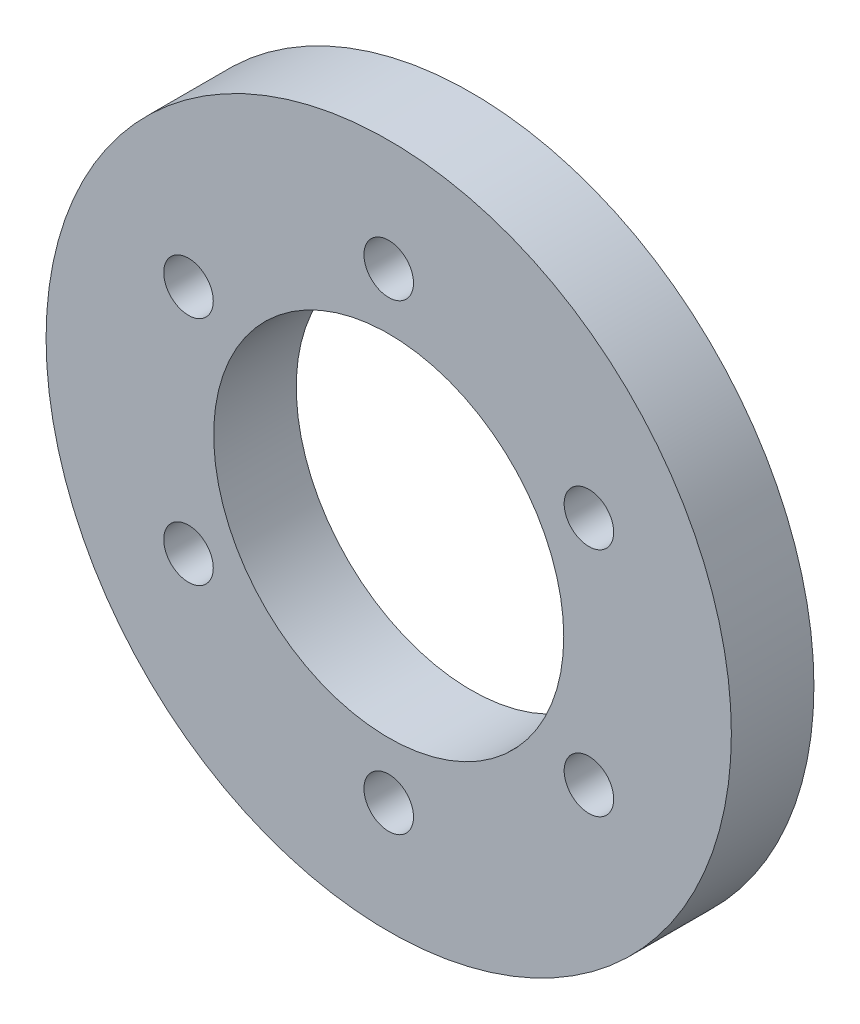
ISO-10303-21;
HEADER;
FILE_DESCRIPTION(('STEP AP214'),'2;1');
FILE_NAME('part.step','',(''),(''),'','','');
FILE_SCHEMA(('AUTOMOTIVE_DESIGN { 1 0 10303 214 1 1 1 1 }'));
ENDSEC;
DATA;
#1=APPLICATION_CONTEXT('core data for automotive mechanical design processes');
#2=APPLICATION_PROTOCOL_DEFINITION('international standard','automotive_design',2000,#1);
#3=PRODUCT_CONTEXT('',#1,'mechanical');
#4=PRODUCT('Part','Part','',(#3));
#5=PRODUCT_RELATED_PRODUCT_CATEGORY('part','',(#4));
#6=PRODUCT_DEFINITION_FORMATION('','',#4);
#7=PRODUCT_DEFINITION_CONTEXT('part definition',#1,'design');
#8=PRODUCT_DEFINITION('design','',#6,#7);
#9=PRODUCT_DEFINITION_SHAPE('','',#8);
#10=(LENGTH_UNIT() NAMED_UNIT(*) SI_UNIT(.MILLI.,.METRE.));
#11=(NAMED_UNIT(*) PLANE_ANGLE_UNIT() SI_UNIT($,.RADIAN.));
#12=(NAMED_UNIT(*) SI_UNIT($,.STERADIAN.) SOLID_ANGLE_UNIT());
#13=UNCERTAINTY_MEASURE_WITH_UNIT(LENGTH_MEASURE(1.E-05),#10,'distance_accuracy_value','');
#14=(GEOMETRIC_REPRESENTATION_CONTEXT(3) GLOBAL_UNCERTAINTY_ASSIGNED_CONTEXT((#13)) GLOBAL_UNIT_ASSIGNED_CONTEXT((#10,
#11,#12)) REPRESENTATION_CONTEXT('',''));
#15=CARTESIAN_POINT('',(0.,0.,0.));
#16=DIRECTION('',(0.,0.,1.));
#17=DIRECTION('',(1.,0.,0.));
#18=AXIS2_PLACEMENT_3D('',#15,#16,#17);
#19=CARTESIAN_POINT('',(5.34781108285642E-11,-5.42088596233725E-11,5.));
#20=DIRECTION('',(0.,0.,1.));
#21=DIRECTION('',(1.,0.,0.));
#22=AXIS2_PLACEMENT_3D('',#19,#20,#21);
#23=PLANE('',#22);
#24=CARTESIAN_POINT('',(5.03034523757773E-11,13.9999999999458,5.));
#25=DIRECTION('',(0.,0.,1.));
#26=DIRECTION('',(1.,0.,0.));
#27=AXIS2_PLACEMENT_3D('',#24,#25,#26);
#28=CIRCLE('',#27,1.5);
#29=CARTESIAN_POINT('',(1.5000000000503,13.9999999999458,5.));
#30=VERTEX_POINT('',#29);
#31=EDGE_CURVE('E79',#30,#30,#28,.T.);
#32=ORIENTED_EDGE('',*,*,#31,.F.);
#33=EDGE_LOOP('',(#32));
#34=FACE_BOUND('',#33,.T.);
#35=CARTESIAN_POINT('',(12.1243556530372,-7.00000000005146,5.));
#36=DIRECTION('',(0.,0.,1.));
#37=DIRECTION('',(1.,0.,0.));
#38=AXIS2_PLACEMENT_3D('',#35,#36,#37);
#39=CIRCLE('',#38,1.5);
#40=CARTESIAN_POINT('',(13.6243556530372,-7.00000000005146,5.));
#41=VERTEX_POINT('',#40);
#42=EDGE_CURVE('E67',#41,#41,#39,.T.);
#43=ORIENTED_EDGE('',*,*,#42,.F.);
#44=EDGE_LOOP('',(#43));
#45=FACE_BOUND('',#44,.T.);
#46=CARTESIAN_POINT('',(-12.124355652927,-7.00000000005696,5.));
#47=DIRECTION('',(0.,0.,1.));
#48=DIRECTION('',(1.,0.,0.));
#49=AXIS2_PLACEMENT_3D('',#46,#47,#48);
#50=CIRCLE('',#49,1.5);
#51=CARTESIAN_POINT('',(-10.624355652927,-7.00000000005696,5.));
#52=VERTEX_POINT('',#51);
#53=EDGE_CURVE('E55',#52,#52,#50,.T.);
#54=ORIENTED_EDGE('',*,*,#53,.F.);
#55=EDGE_LOOP('',(#54));
#56=FACE_BOUND('',#55,.T.);
#57=CARTESIAN_POINT('',(5.34781108285642E-11,-5.42088596233725E-11,5.));
#58=DIRECTION('',(0.,0.,1.));
#59=DIRECTION('',(1.,0.,0.));
#60=AXIS2_PLACEMENT_3D('',#57,#58,#59);
#61=CIRCLE('',#60,20.7499999999);
#62=CARTESIAN_POINT('',(20.7499999999535,-5.42088596233725E-11,5.));
#63=VERTEX_POINT('',#62);
#64=EDGE_CURVE('E10',#63,#63,#61,.T.);
#65=ORIENTED_EDGE('',*,*,#64,.T.);
#66=EDGE_LOOP('',(#65));
#67=FACE_BOUND('',#66,.T.);
#68=CARTESIAN_POINT('',(-12.1243556529302,6.99999999994304,5.));
#69=DIRECTION('',(0.,0.,1.));
#70=DIRECTION('',(1.,0.,0.));
#71=AXIS2_PLACEMENT_3D('',#68,#69,#70);
#72=CIRCLE('',#71,1.5);
#73=CARTESIAN_POINT('',(-10.6243556529302,6.99999999994304,5.));
#74=VERTEX_POINT('',#73);
#75=EDGE_CURVE('E50',#74,#74,#72,.T.);
#76=ORIENTED_EDGE('',*,*,#75,.F.);
#77=EDGE_LOOP('',(#76));
#78=FACE_BOUND('',#77,.T.);
#79=CARTESIAN_POINT('',(5.66483283892527E-11,-14.0000000000542,5.));
#80=DIRECTION('',(0.,0.,1.));
#81=DIRECTION('',(1.,0.,0.));
#82=AXIS2_PLACEMENT_3D('',#79,#80,#81);
#83=CIRCLE('',#82,1.5);
#84=CARTESIAN_POINT('',(1.50000000005665,-14.0000000000542,5.));
#85=VERTEX_POINT('',#84);
#86=EDGE_CURVE('E61',#85,#85,#83,.T.);
#87=ORIENTED_EDGE('',*,*,#86,.F.);
#88=EDGE_LOOP('',(#87));
#89=FACE_BOUND('',#88,.T.);
#90=CARTESIAN_POINT('',(12.124355653034,6.99999999994854,5.));
#91=DIRECTION('',(0.,0.,1.));
#92=DIRECTION('',(1.,0.,0.));
#93=AXIS2_PLACEMENT_3D('',#90,#91,#92);
#94=CIRCLE('',#93,1.5);
#95=CARTESIAN_POINT('',(13.624355653034,6.99999999994854,5.));
#96=VERTEX_POINT('',#95);
#97=EDGE_CURVE('E73',#96,#96,#94,.T.);
#98=ORIENTED_EDGE('',*,*,#97,.F.);
#99=EDGE_LOOP('',(#98));
#100=FACE_BOUND('',#99,.T.);
#101=CARTESIAN_POINT('',(5.34781108285642E-11,-5.42088596233725E-11,5.));
#102=DIRECTION('',(0.,0.,1.));
#103=DIRECTION('',(1.,0.,0.));
#104=AXIS2_PLACEMENT_3D('',#101,#102,#103);
#105=CIRCLE('',#104,10.6);
#106=CARTESIAN_POINT('',(10.6000000000535,-5.42088596233725E-11,5.));
#107=VERTEX_POINT('',#106);
#108=EDGE_CURVE('E85',#107,#107,#105,.T.);
#109=ORIENTED_EDGE('',*,*,#108,.F.);
#110=EDGE_LOOP('',(#109));
#111=FACE_BOUND('',#110,.T.);
#112=ADVANCED_FACE('F39',(#34,#45,#56,#67,#78,#89,#100,#111),#23,.T.);
#113=CARTESIAN_POINT('',(5.34781108285642E-11,-5.42088596233725E-11,0.));
#114=DIRECTION('',(0.,0.,1.));
#115=DIRECTION('',(1.,0.,0.));
#116=AXIS2_PLACEMENT_3D('',#113,#114,#115);
#117=PLANE('',#116);
#118=CARTESIAN_POINT('',(5.34781108285642E-11,-5.42088596233725E-11,0.));
#119=DIRECTION('',(0.,0.,1.));
#120=DIRECTION('',(1.,0.,0.));
#121=AXIS2_PLACEMENT_3D('',#118,#119,#120);
#122=CIRCLE('',#121,20.7499999999);
#123=CARTESIAN_POINT('',(20.7499999999535,-5.42088596233725E-11,0.));
#124=VERTEX_POINT('',#123);
#125=EDGE_CURVE('E43',#124,#124,#122,.T.);
#126=ORIENTED_EDGE('',*,*,#125,.F.);
#127=EDGE_LOOP('',(#126));
#128=FACE_BOUND('',#127,.T.);
#129=CARTESIAN_POINT('',(-12.1243556529302,6.99999999994304,0.));
#130=DIRECTION('',(0.,0.,1.));
#131=DIRECTION('',(1.,0.,0.));
#132=AXIS2_PLACEMENT_3D('',#129,#130,#131);
#133=CIRCLE('',#132,1.5);
#134=CARTESIAN_POINT('',(-10.6243556529302,6.99999999994304,0.));
#135=VERTEX_POINT('',#134);
#136=EDGE_CURVE('E52',#135,#135,#133,.T.);
#137=ORIENTED_EDGE('',*,*,#136,.T.);
#138=EDGE_LOOP('',(#137));
#139=FACE_BOUND('',#138,.T.);
#140=CARTESIAN_POINT('',(-12.124355652927,-7.00000000005696,0.));
#141=DIRECTION('',(0.,0.,1.));
#142=DIRECTION('',(1.,0.,0.));
#143=AXIS2_PLACEMENT_3D('',#140,#141,#142);
#144=CIRCLE('',#143,1.5);
#145=CARTESIAN_POINT('',(-10.624355652927,-7.00000000005696,0.));
#146=VERTEX_POINT('',#145);
#147=EDGE_CURVE('E58',#146,#146,#144,.T.);
#148=ORIENTED_EDGE('',*,*,#147,.T.);
#149=EDGE_LOOP('',(#148));
#150=FACE_BOUND('',#149,.T.);
#151=CARTESIAN_POINT('',(5.66483283892527E-11,-14.0000000000542,0.));
#152=DIRECTION('',(0.,0.,1.));
#153=DIRECTION('',(1.,0.,0.));
#154=AXIS2_PLACEMENT_3D('',#151,#152,#153);
#155=CIRCLE('',#154,1.5);
#156=CARTESIAN_POINT('',(1.50000000005665,-14.0000000000542,0.));
#157=VERTEX_POINT('',#156);
#158=EDGE_CURVE('E64',#157,#157,#155,.T.);
#159=ORIENTED_EDGE('',*,*,#158,.T.);
#160=EDGE_LOOP('',(#159));
#161=FACE_BOUND('',#160,.T.);
#162=CARTESIAN_POINT('',(12.1243556530372,-7.00000000005146,0.));
#163=DIRECTION('',(0.,0.,1.));
#164=DIRECTION('',(1.,0.,0.));
#165=AXIS2_PLACEMENT_3D('',#162,#163,#164);
#166=CIRCLE('',#165,1.5);
#167=CARTESIAN_POINT('',(13.6243556530372,-7.00000000005146,0.));
#168=VERTEX_POINT('',#167);
#169=EDGE_CURVE('E70',#168,#168,#166,.T.);
#170=ORIENTED_EDGE('',*,*,#169,.T.);
#171=EDGE_LOOP('',(#170));
#172=FACE_BOUND('',#171,.T.);
#173=CARTESIAN_POINT('',(12.124355653034,6.99999999994854,0.));
#174=DIRECTION('',(0.,0.,1.));
#175=DIRECTION('',(1.,0.,0.));
#176=AXIS2_PLACEMENT_3D('',#173,#174,#175);
#177=CIRCLE('',#176,1.5);
#178=CARTESIAN_POINT('',(13.624355653034,6.99999999994854,0.));
#179=VERTEX_POINT('',#178);
#180=EDGE_CURVE('E76',#179,#179,#177,.T.);
#181=ORIENTED_EDGE('',*,*,#180,.T.);
#182=EDGE_LOOP('',(#181));
#183=FACE_BOUND('',#182,.T.);
#184=CARTESIAN_POINT('',(5.03034523757773E-11,13.9999999999458,0.));
#185=DIRECTION('',(0.,0.,1.));
#186=DIRECTION('',(1.,0.,0.));
#187=AXIS2_PLACEMENT_3D('',#184,#185,#186);
#188=CIRCLE('',#187,1.5);
#189=CARTESIAN_POINT('',(1.5000000000503,13.9999999999458,0.));
#190=VERTEX_POINT('',#189);
#191=EDGE_CURVE('E82',#190,#190,#188,.T.);
#192=ORIENTED_EDGE('',*,*,#191,.T.);
#193=EDGE_LOOP('',(#192));
#194=FACE_BOUND('',#193,.T.);
#195=CARTESIAN_POINT('',(5.34781108285642E-11,-5.42088596233725E-11,0.));
#196=DIRECTION('',(0.,0.,1.));
#197=DIRECTION('',(1.,0.,0.));
#198=AXIS2_PLACEMENT_3D('',#195,#196,#197);
#199=CIRCLE('',#198,10.6);
#200=CARTESIAN_POINT('',(10.6000000000535,-5.42088596233725E-11,0.));
#201=VERTEX_POINT('',#200);
#202=EDGE_CURVE('E88',#201,#201,#199,.T.);
#203=ORIENTED_EDGE('',*,*,#202,.T.);
#204=EDGE_LOOP('',(#203));
#205=FACE_BOUND('',#204,.T.);
#206=ADVANCED_FACE('F97',(#128,#139,#150,#161,#172,#183,#194,#205),#117,.F.);
#207=CARTESIAN_POINT('',(5.34781108285642E-11,-5.42088596233725E-11,5.));
#208=DIRECTION('',(0.,0.,-1.));
#209=DIRECTION('',(-1.,0.,0.));
#210=AXIS2_PLACEMENT_3D('',#207,#208,#209);
#211=CYLINDRICAL_SURFACE('',#210,20.7499999999);
#212=ORIENTED_EDGE('',*,*,#64,.F.);
#213=EDGE_LOOP('',(#212));
#214=FACE_BOUND('',#213,.T.);
#215=ORIENTED_EDGE('',*,*,#125,.T.);
#216=EDGE_LOOP('',(#215));
#217=FACE_BOUND('',#216,.T.);
#218=ADVANCED_FACE('F41',(#214,#217),#211,.T.);
#219=CARTESIAN_POINT('',(-12.1243556529302,6.99999999994304,5.));
#220=DIRECTION('',(0.,0.,-1.));
#221=DIRECTION('',(-1.,0.,0.));
#222=AXIS2_PLACEMENT_3D('',#219,#220,#221);
#223=CYLINDRICAL_SURFACE('',#222,1.5);
#224=ORIENTED_EDGE('',*,*,#136,.F.);
#225=EDGE_LOOP('',(#224));
#226=FACE_BOUND('',#225,.T.);
#227=ORIENTED_EDGE('',*,*,#75,.T.);
#228=EDGE_LOOP('',(#227));
#229=FACE_BOUND('',#228,.T.);
#230=ADVANCED_FACE('F107',(#226,#229),#223,.F.);
#231=CARTESIAN_POINT('',(-12.124355652927,-7.00000000005696,5.));
#232=DIRECTION('',(0.,0.,-1.));
#233=DIRECTION('',(-1.,0.,0.));
#234=AXIS2_PLACEMENT_3D('',#231,#232,#233);
#235=CYLINDRICAL_SURFACE('',#234,1.5);
#236=ORIENTED_EDGE('',*,*,#147,.F.);
#237=EDGE_LOOP('',(#236));
#238=FACE_BOUND('',#237,.T.);
#239=ORIENTED_EDGE('',*,*,#53,.T.);
#240=EDGE_LOOP('',(#239));
#241=FACE_BOUND('',#240,.T.);
#242=ADVANCED_FACE('F110',(#238,#241),#235,.F.);
#243=CARTESIAN_POINT('',(5.66483283892527E-11,-14.0000000000542,5.));
#244=DIRECTION('',(0.,0.,-1.));
#245=DIRECTION('',(-1.,0.,0.));
#246=AXIS2_PLACEMENT_3D('',#243,#244,#245);
#247=CYLINDRICAL_SURFACE('',#246,1.5);
#248=ORIENTED_EDGE('',*,*,#158,.F.);
#249=EDGE_LOOP('',(#248));
#250=FACE_BOUND('',#249,.T.);
#251=ORIENTED_EDGE('',*,*,#86,.T.);
#252=EDGE_LOOP('',(#251));
#253=FACE_BOUND('',#252,.T.);
#254=ADVANCED_FACE('F114',(#250,#253),#247,.F.);
#255=CARTESIAN_POINT('',(12.1243556530372,-7.00000000005146,5.));
#256=DIRECTION('',(0.,0.,-1.));
#257=DIRECTION('',(-1.,0.,0.));
#258=AXIS2_PLACEMENT_3D('',#255,#256,#257);
#259=CYLINDRICAL_SURFACE('',#258,1.5);
#260=ORIENTED_EDGE('',*,*,#169,.F.);
#261=EDGE_LOOP('',(#260));
#262=FACE_BOUND('',#261,.T.);
#263=ORIENTED_EDGE('',*,*,#42,.T.);
#264=EDGE_LOOP('',(#263));
#265=FACE_BOUND('',#264,.T.);
#266=ADVANCED_FACE('F118',(#262,#265),#259,.F.);
#267=CARTESIAN_POINT('',(12.124355653034,6.99999999994854,5.));
#268=DIRECTION('',(0.,0.,-1.));
#269=DIRECTION('',(-1.,0.,0.));
#270=AXIS2_PLACEMENT_3D('',#267,#268,#269);
#271=CYLINDRICAL_SURFACE('',#270,1.5);
#272=ORIENTED_EDGE('',*,*,#180,.F.);
#273=EDGE_LOOP('',(#272));
#274=FACE_BOUND('',#273,.T.);
#275=ORIENTED_EDGE('',*,*,#97,.T.);
#276=EDGE_LOOP('',(#275));
#277=FACE_BOUND('',#276,.T.);
#278=ADVANCED_FACE('F122',(#274,#277),#271,.F.);
#279=CARTESIAN_POINT('',(5.03034523757773E-11,13.9999999999458,5.));
#280=DIRECTION('',(0.,0.,-1.));
#281=DIRECTION('',(-1.,0.,0.));
#282=AXIS2_PLACEMENT_3D('',#279,#280,#281);
#283=CYLINDRICAL_SURFACE('',#282,1.5);
#284=ORIENTED_EDGE('',*,*,#191,.F.);
#285=EDGE_LOOP('',(#284));
#286=FACE_BOUND('',#285,.T.);
#287=ORIENTED_EDGE('',*,*,#31,.T.);
#288=EDGE_LOOP('',(#287));
#289=FACE_BOUND('',#288,.T.);
#290=ADVANCED_FACE('F126',(#286,#289),#283,.F.);
#291=CARTESIAN_POINT('',(5.34781108285642E-11,-5.42088596233725E-11,5.));
#292=DIRECTION('',(0.,0.,-1.));
#293=DIRECTION('',(-1.,0.,0.));
#294=AXIS2_PLACEMENT_3D('',#291,#292,#293);
#295=CYLINDRICAL_SURFACE('',#294,10.6);
#296=ORIENTED_EDGE('',*,*,#202,.F.);
#297=EDGE_LOOP('',(#296));
#298=FACE_BOUND('',#297,.T.);
#299=ORIENTED_EDGE('',*,*,#108,.T.);
#300=EDGE_LOOP('',(#299));
#301=FACE_BOUND('',#300,.T.);
#302=ADVANCED_FACE('F94',(#298,#301),#295,.F.);
#303=CLOSED_SHELL('',(#112,#206,#218,#230,#242,#254,#266,#278,#290,#302));
#304=MANIFOLD_SOLID_BREP('B2',#303);
#305=ADVANCED_BREP_SHAPE_REPRESENTATION('',(#18,#304),#14);
#306=SHAPE_DEFINITION_REPRESENTATION(#9,#305);
ENDSEC;
END-ISO-10303-21;
